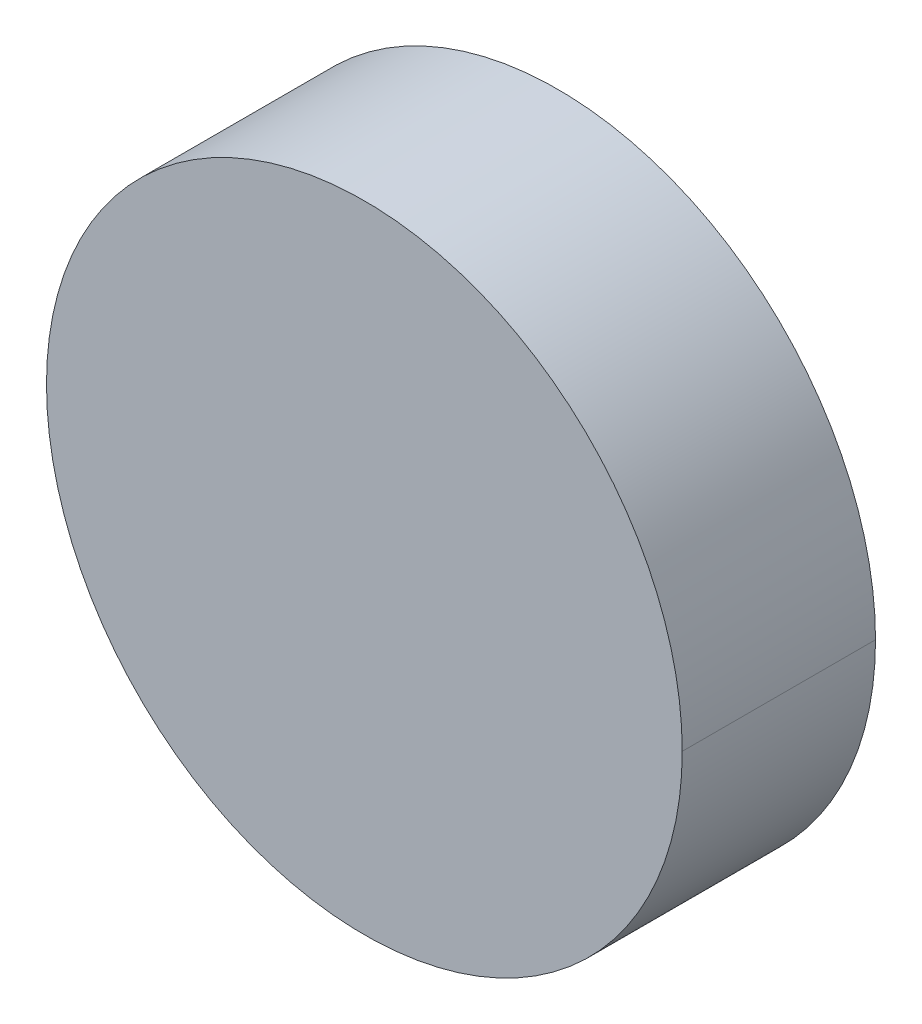
ISO-10303-21;
HEADER;
FILE_DESCRIPTION(('STEP AP214'),'2;1');
FILE_NAME('part.step','',(''),(''),'','','');
FILE_SCHEMA(('AUTOMOTIVE_DESIGN { 1 0 10303 214 1 1 1 1 }'));
ENDSEC;
DATA;
#1=APPLICATION_CONTEXT('core data for automotive mechanical design processes');
#2=APPLICATION_PROTOCOL_DEFINITION('international standard','automotive_design',2000,#1);
#3=PRODUCT_CONTEXT('',#1,'mechanical');
#4=PRODUCT('Part','Part','',(#3));
#5=PRODUCT_RELATED_PRODUCT_CATEGORY('part','',(#4));
#6=PRODUCT_DEFINITION_FORMATION('','',#4);
#7=PRODUCT_DEFINITION_CONTEXT('part definition',#1,'design');
#8=PRODUCT_DEFINITION('design','',#6,#7);
#9=PRODUCT_DEFINITION_SHAPE('','',#8);
#10=(LENGTH_UNIT() NAMED_UNIT(*) SI_UNIT(.MILLI.,.METRE.));
#11=(NAMED_UNIT(*) PLANE_ANGLE_UNIT() SI_UNIT($,.RADIAN.));
#12=(NAMED_UNIT(*) SI_UNIT($,.STERADIAN.) SOLID_ANGLE_UNIT());
#13=UNCERTAINTY_MEASURE_WITH_UNIT(LENGTH_MEASURE(1.E-05),#10,'distance_accuracy_value','');
#14=(GEOMETRIC_REPRESENTATION_CONTEXT(3) GLOBAL_UNCERTAINTY_ASSIGNED_CONTEXT((#13)) GLOBAL_UNIT_ASSIGNED_CONTEXT((#10,
#11,#12)) REPRESENTATION_CONTEXT('',''));
#15=CARTESIAN_POINT('',(0.,0.,0.));
#16=DIRECTION('',(0.,0.,1.));
#17=DIRECTION('',(1.,0.,0.));
#18=AXIS2_PLACEMENT_3D('',#15,#16,#17);
#19=CARTESIAN_POINT('',(0.,0.,0.076));
#20=DIRECTION('',(0.,0.,1.));
#21=DIRECTION('',(1.,0.,0.));
#22=AXIS2_PLACEMENT_3D('',#19,#20,#21);
#23=PLANE('',#22);
#24=CARTESIAN_POINT('',(0.,0.,0.076));
#25=DIRECTION('',(0.,0.,1.));
#26=DIRECTION('',(-1.,0.,0.));
#27=AXIS2_PLACEMENT_3D('',#24,#25,#26);
#28=CIRCLE('',#27,0.125);
#29=CARTESIAN_POINT('',(-0.125,0.,0.076));
#30=VERTEX_POINT('',#29);
#31=CARTESIAN_POINT('',(0.125,0.,0.076));
#32=VERTEX_POINT('',#31);
#33=EDGE_CURVE('E11',#30,#32,#28,.T.);
#34=ORIENTED_EDGE('',*,*,#33,.T.);
#35=CARTESIAN_POINT('',(0.,0.,0.076));
#36=DIRECTION('',(0.,0.,1.));
#37=DIRECTION('',(1.,0.,0.));
#38=AXIS2_PLACEMENT_3D('',#35,#36,#37);
#39=CIRCLE('',#38,0.125);
#40=EDGE_CURVE('E59',#32,#30,#39,.T.);
#41=ORIENTED_EDGE('',*,*,#40,.T.);
#42=EDGE_LOOP('',(#34,#41));
#43=FACE_BOUND('',#42,.T.);
#44=ADVANCED_FACE('F18',(#43),#23,.T.);
#45=CARTESIAN_POINT('',(0.,0.,0.));
#46=DIRECTION('',(0.,0.,1.));
#47=DIRECTION('',(1.,0.,0.));
#48=AXIS2_PLACEMENT_3D('',#45,#46,#47);
#49=CYLINDRICAL_SURFACE('',#48,0.125);
#50=DIRECTION('',(0.,0.,1.));
#51=VECTOR('',#50,1.);
#52=CARTESIAN_POINT('',(0.125,0.,0.));
#53=LINE('',#52,#51);
#54=CARTESIAN_POINT('',(0.125,0.,0.));
#55=VERTEX_POINT('',#54);
#56=EDGE_CURVE('E22',#55,#32,#53,.T.);
#57=ORIENTED_EDGE('',*,*,#56,.T.);
#58=ORIENTED_EDGE('',*,*,#33,.F.);
#59=DIRECTION('',(0.,0.,1.));
#60=VECTOR('',#59,1.);
#61=CARTESIAN_POINT('',(-0.125,0.,0.));
#62=LINE('',#61,#60);
#63=CARTESIAN_POINT('',(-0.125,0.,0.));
#64=VERTEX_POINT('',#63);
#65=EDGE_CURVE('E51',#64,#30,#62,.T.);
#66=ORIENTED_EDGE('',*,*,#65,.F.);
#67=CARTESIAN_POINT('',(0.,0.,0.));
#68=DIRECTION('',(0.,0.,1.));
#69=DIRECTION('',(-1.,0.,0.));
#70=AXIS2_PLACEMENT_3D('',#67,#68,#69);
#71=CIRCLE('',#70,0.125);
#72=EDGE_CURVE('E55',#64,#55,#71,.T.);
#73=ORIENTED_EDGE('',*,*,#72,.T.);
#74=EDGE_LOOP('',(#57,#58,#66,#73));
#75=FACE_BOUND('',#74,.T.);
#76=ADVANCED_FACE('F53',(#75),#49,.T.);
#77=CARTESIAN_POINT('',(0.,0.,0.));
#78=DIRECTION('',(0.,0.,1.));
#79=DIRECTION('',(1.,0.,0.));
#80=AXIS2_PLACEMENT_3D('',#77,#78,#79);
#81=CYLINDRICAL_SURFACE('',#80,0.125);
#82=ORIENTED_EDGE('',*,*,#65,.T.);
#83=ORIENTED_EDGE('',*,*,#40,.F.);
#84=ORIENTED_EDGE('',*,*,#56,.F.);
#85=CARTESIAN_POINT('',(0.,0.,0.));
#86=DIRECTION('',(0.,0.,1.));
#87=DIRECTION('',(1.,0.,0.));
#88=AXIS2_PLACEMENT_3D('',#85,#86,#87);
#89=CIRCLE('',#88,0.125);
#90=EDGE_CURVE('E60',#55,#64,#89,.T.);
#91=ORIENTED_EDGE('',*,*,#90,.T.);
#92=EDGE_LOOP('',(#82,#83,#84,#91));
#93=FACE_BOUND('',#92,.T.);
#94=ADVANCED_FACE('F63',(#93),#81,.T.);
#95=CARTESIAN_POINT('',(0.,0.,0.));
#96=DIRECTION('',(0.,0.,1.));
#97=DIRECTION('',(1.,0.,0.));
#98=AXIS2_PLACEMENT_3D('',#95,#96,#97);
#99=PLANE('',#98);
#100=ORIENTED_EDGE('',*,*,#72,.F.);
#101=ORIENTED_EDGE('',*,*,#90,.F.);
#102=EDGE_LOOP('',(#100,#101));
#103=FACE_BOUND('',#102,.T.);
#104=ADVANCED_FACE('F20',(#103),#99,.F.);
#105=CLOSED_SHELL('',(#44,#76,#94,#104));
#106=MANIFOLD_SOLID_BREP('B1',#105);
#107=ADVANCED_BREP_SHAPE_REPRESENTATION('',(#18,#106),#14);
#108=SHAPE_DEFINITION_REPRESENTATION(#9,#107);
ENDSEC;
END-ISO-10303-21;
